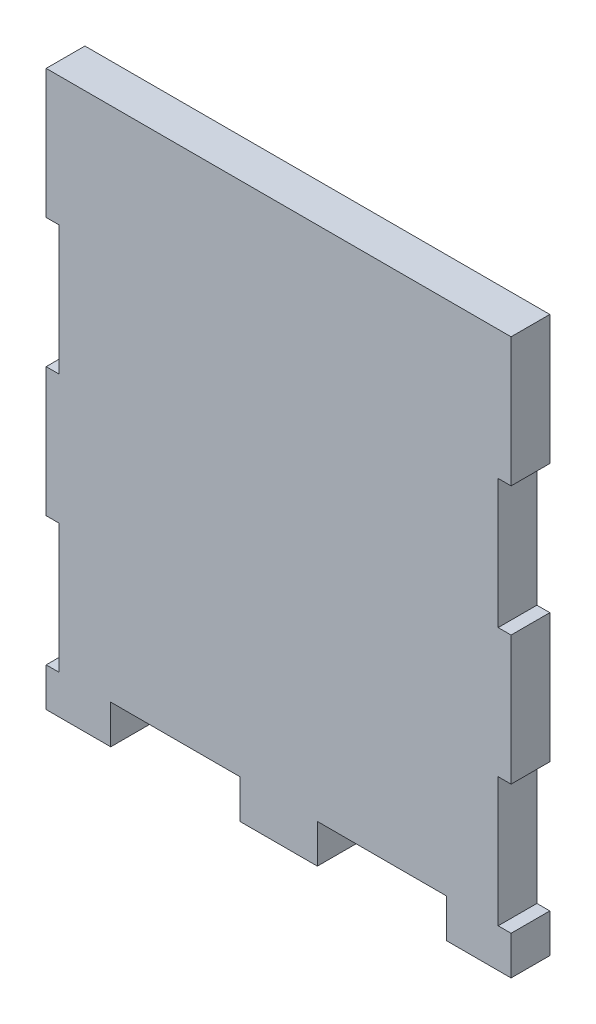
ISO-10303-21;
HEADER;
FILE_DESCRIPTION(('STEP AP214'),'2;1');
FILE_NAME('part.step','',(''),(''),'','','');
FILE_SCHEMA(('AUTOMOTIVE_DESIGN { 1 0 10303 214 1 1 1 1 }'));
ENDSEC;
DATA;
#1=APPLICATION_CONTEXT('core data for automotive mechanical design processes');
#2=APPLICATION_PROTOCOL_DEFINITION('international standard','automotive_design',2000,#1);
#3=PRODUCT_CONTEXT('',#1,'mechanical');
#4=PRODUCT('Part','Part','',(#3));
#5=PRODUCT_RELATED_PRODUCT_CATEGORY('part','',(#4));
#6=PRODUCT_DEFINITION_FORMATION('','',#4);
#7=PRODUCT_DEFINITION_CONTEXT('part definition',#1,'design');
#8=PRODUCT_DEFINITION('design','',#6,#7);
#9=PRODUCT_DEFINITION_SHAPE('','',#8);
#10=(LENGTH_UNIT() NAMED_UNIT(*) SI_UNIT(.MILLI.,.METRE.));
#11=(NAMED_UNIT(*) PLANE_ANGLE_UNIT() SI_UNIT($,.RADIAN.));
#12=(NAMED_UNIT(*) SI_UNIT($,.STERADIAN.) SOLID_ANGLE_UNIT());
#13=UNCERTAINTY_MEASURE_WITH_UNIT(LENGTH_MEASURE(1.E-05),#10,'distance_accuracy_value','');
#14=(GEOMETRIC_REPRESENTATION_CONTEXT(3) GLOBAL_UNCERTAINTY_ASSIGNED_CONTEXT((#13)) GLOBAL_UNIT_ASSIGNED_CONTEXT((#10,
#11,#12)) REPRESENTATION_CONTEXT('',''));
#15=CARTESIAN_POINT('',(0.,0.,0.));
#16=DIRECTION('',(0.,0.,1.));
#17=DIRECTION('',(1.,0.,0.));
#18=AXIS2_PLACEMENT_3D('',#15,#16,#17);
#19=CARTESIAN_POINT('',(0.,0.,3.));
#20=DIRECTION('',(0.,-1.,0.));
#21=DIRECTION('',(1.,0.,0.));
#22=AXIS2_PLACEMENT_3D('',#19,#20,#21);
#23=PLANE('',#22);
#24=DIRECTION('',(-1.,0.,0.));
#25=VECTOR('',#24,1.);
#26=CARTESIAN_POINT('',(0.,0.,0.));
#27=LINE('',#26,#25);
#28=CARTESIAN_POINT('',(15.,0.,0.));
#29=VERTEX_POINT('',#28);
#30=CARTESIAN_POINT('',(5.,0.,0.));
#31=VERTEX_POINT('',#30);
#32=EDGE_CURVE('E250',#29,#31,#27,.T.);
#33=ORIENTED_EDGE('',*,*,#32,.F.);
#34=DIRECTION('',(0.,0.,-1.));
#35=VECTOR('',#34,1.);
#36=CARTESIAN_POINT('',(15.,0.,3.));
#37=LINE('',#36,#35);
#38=CARTESIAN_POINT('',(15.,0.,3.));
#39=VERTEX_POINT('',#38);
#40=EDGE_CURVE('E11',#39,#29,#37,.T.);
#41=ORIENTED_EDGE('',*,*,#40,.F.);
#42=DIRECTION('',(-1.,0.,0.));
#43=VECTOR('',#42,1.);
#44=CARTESIAN_POINT('',(0.,0.,3.));
#45=LINE('',#44,#43);
#46=CARTESIAN_POINT('',(5.,0.,3.));
#47=VERTEX_POINT('',#46);
#48=EDGE_CURVE('E319',#39,#47,#45,.T.);
#49=ORIENTED_EDGE('',*,*,#48,.T.);
#50=DIRECTION('',(0.,0.,-1.));
#51=VECTOR('',#50,1.);
#52=CARTESIAN_POINT('',(5.,0.,3.));
#53=LINE('',#52,#51);
#54=EDGE_CURVE('E51',#47,#31,#53,.T.);
#55=ORIENTED_EDGE('',*,*,#54,.T.);
#56=EDGE_LOOP('',(#33,#41,#49,#55));
#57=FACE_BOUND('',#56,.T.);
#58=ADVANCED_FACE('F35',(#57),#23,.T.);
#59=CARTESIAN_POINT('',(15.,0.,3.));
#60=DIRECTION('',(1.,0.,0.));
#61=DIRECTION('',(0.,1.,0.));
#62=AXIS2_PLACEMENT_3D('',#59,#60,#61);
#63=PLANE('',#62);
#64=DIRECTION('',(0.,-1.,0.));
#65=VECTOR('',#64,1.);
#66=CARTESIAN_POINT('',(15.,0.,0.));
#67=LINE('',#66,#65);
#68=CARTESIAN_POINT('',(15.,-3.,0.));
#69=VERTEX_POINT('',#68);
#70=EDGE_CURVE('E252',#29,#69,#67,.T.);
#71=ORIENTED_EDGE('',*,*,#70,.T.);
#72=DIRECTION('',(0.,0.,-1.));
#73=VECTOR('',#72,1.);
#74=CARTESIAN_POINT('',(15.,-3.,3.));
#75=LINE('',#74,#73);
#76=CARTESIAN_POINT('',(15.,-3.,3.));
#77=VERTEX_POINT('',#76);
#78=EDGE_CURVE('E43',#77,#69,#75,.T.);
#79=ORIENTED_EDGE('',*,*,#78,.F.);
#80=DIRECTION('',(0.,-1.,0.));
#81=VECTOR('',#80,1.);
#82=CARTESIAN_POINT('',(15.,0.,3.));
#83=LINE('',#82,#81);
#84=EDGE_CURVE('E397',#39,#77,#83,.T.);
#85=ORIENTED_EDGE('',*,*,#84,.F.);
#86=ORIENTED_EDGE('',*,*,#40,.T.);
#87=EDGE_LOOP('',(#71,#79,#85,#86));
#88=FACE_BOUND('',#87,.T.);
#89=ADVANCED_FACE('F470',(#88),#63,.F.);
#90=CARTESIAN_POINT('',(0.,-3.,3.));
#91=DIRECTION('',(0.,1.,0.));
#92=DIRECTION('',(0.,0.,1.));
#93=AXIS2_PLACEMENT_3D('',#90,#91,#92);
#94=PLANE('',#93);
#95=DIRECTION('',(1.,0.,0.));
#96=VECTOR('',#95,1.);
#97=CARTESIAN_POINT('',(0.,-3.,0.));
#98=LINE('',#97,#96);
#99=CARTESIAN_POINT('',(21.,-3.,0.));
#100=VERTEX_POINT('',#99);
#101=EDGE_CURVE('E254',#69,#100,#98,.T.);
#102=ORIENTED_EDGE('',*,*,#101,.T.);
#103=DIRECTION('',(0.,0.,-1.));
#104=VECTOR('',#103,1.);
#105=CARTESIAN_POINT('',(21.,-3.,3.));
#106=LINE('',#105,#104);
#107=CARTESIAN_POINT('',(21.,-3.,3.));
#108=VERTEX_POINT('',#107);
#109=EDGE_CURVE('E370',#108,#100,#106,.T.);
#110=ORIENTED_EDGE('',*,*,#109,.F.);
#111=DIRECTION('',(1.,0.,0.));
#112=VECTOR('',#111,1.);
#113=CARTESIAN_POINT('',(0.,-3.,3.));
#114=LINE('',#113,#112);
#115=EDGE_CURVE('E378',#77,#108,#114,.T.);
#116=ORIENTED_EDGE('',*,*,#115,.F.);
#117=ORIENTED_EDGE('',*,*,#78,.T.);
#118=EDGE_LOOP('',(#102,#110,#116,#117));
#119=FACE_BOUND('',#118,.T.);
#120=ADVANCED_FACE('F376',(#119),#94,.F.);
#121=CARTESIAN_POINT('',(21.,0.,3.));
#122=DIRECTION('',(1.,0.,0.));
#123=DIRECTION('',(0.,0.,-1.));
#124=AXIS2_PLACEMENT_3D('',#121,#122,#123);
#125=PLANE('',#124);
#126=DIRECTION('',(0.,-1.,0.));
#127=VECTOR('',#126,1.);
#128=CARTESIAN_POINT('',(21.,0.,0.));
#129=LINE('',#128,#127);
#130=CARTESIAN_POINT('',(21.,0.,0.));
#131=VERTEX_POINT('',#130);
#132=EDGE_CURVE('E257',#131,#100,#129,.T.);
#133=ORIENTED_EDGE('',*,*,#132,.F.);
#134=DIRECTION('',(0.,0.,-1.));
#135=VECTOR('',#134,1.);
#136=CARTESIAN_POINT('',(21.,0.,3.));
#137=LINE('',#136,#135);
#138=CARTESIAN_POINT('',(21.,0.,3.));
#139=VERTEX_POINT('',#138);
#140=EDGE_CURVE('E368',#139,#131,#137,.T.);
#141=ORIENTED_EDGE('',*,*,#140,.F.);
#142=DIRECTION('',(0.,-1.,0.));
#143=VECTOR('',#142,1.);
#144=CARTESIAN_POINT('',(21.,0.,3.));
#145=LINE('',#144,#143);
#146=EDGE_CURVE('E390',#139,#108,#145,.T.);
#147=ORIENTED_EDGE('',*,*,#146,.T.);
#148=ORIENTED_EDGE('',*,*,#109,.T.);
#149=EDGE_LOOP('',(#133,#141,#147,#148));
#150=FACE_BOUND('',#149,.T.);
#151=ADVANCED_FACE('F387',(#150),#125,.T.);
#152=CARTESIAN_POINT('',(0.,0.,3.));
#153=DIRECTION('',(0.,-1.,0.));
#154=DIRECTION('',(1.,0.,0.));
#155=AXIS2_PLACEMENT_3D('',#152,#153,#154);
#156=PLANE('',#155);
#157=DIRECTION('',(-1.,0.,0.));
#158=VECTOR('',#157,1.);
#159=CARTESIAN_POINT('',(0.,0.,0.));
#160=LINE('',#159,#158);
#161=CARTESIAN_POINT('',(31.,0.,0.));
#162=VERTEX_POINT('',#161);
#163=EDGE_CURVE('E260',#162,#131,#160,.T.);
#164=ORIENTED_EDGE('',*,*,#163,.F.);
#165=DIRECTION('',(0.,0.,-1.));
#166=VECTOR('',#165,1.);
#167=CARTESIAN_POINT('',(31.,0.,3.));
#168=LINE('',#167,#166);
#169=CARTESIAN_POINT('',(31.,0.,3.));
#170=VERTEX_POINT('',#169);
#171=EDGE_CURVE('E366',#170,#162,#168,.T.);
#172=ORIENTED_EDGE('',*,*,#171,.F.);
#173=DIRECTION('',(-1.,0.,0.));
#174=VECTOR('',#173,1.);
#175=CARTESIAN_POINT('',(0.,0.,3.));
#176=LINE('',#175,#174);
#177=EDGE_CURVE('E393',#170,#139,#176,.T.);
#178=ORIENTED_EDGE('',*,*,#177,.T.);
#179=ORIENTED_EDGE('',*,*,#140,.T.);
#180=EDGE_LOOP('',(#164,#172,#178,#179));
#181=FACE_BOUND('',#180,.T.);
#182=ADVANCED_FACE('F705',(#181),#156,.T.);
#183=CARTESIAN_POINT('',(31.,0.,3.));
#184=DIRECTION('',(1.,0.,0.));
#185=DIRECTION('',(0.,0.,-1.));
#186=AXIS2_PLACEMENT_3D('',#183,#184,#185);
#187=PLANE('',#186);
#188=DIRECTION('',(0.,-1.,0.));
#189=VECTOR('',#188,1.);
#190=CARTESIAN_POINT('',(31.,0.,0.));
#191=LINE('',#190,#189);
#192=CARTESIAN_POINT('',(31.,-3.,0.));
#193=VERTEX_POINT('',#192);
#194=EDGE_CURVE('E263',#162,#193,#191,.T.);
#195=ORIENTED_EDGE('',*,*,#194,.T.);
#196=DIRECTION('',(0.,0.,-1.));
#197=VECTOR('',#196,1.);
#198=CARTESIAN_POINT('',(31.,-3.,3.));
#199=LINE('',#198,#197);
#200=CARTESIAN_POINT('',(31.,-3.,3.));
#201=VERTEX_POINT('',#200);
#202=EDGE_CURVE('E363',#201,#193,#199,.T.);
#203=ORIENTED_EDGE('',*,*,#202,.F.);
#204=DIRECTION('',(0.,-1.,0.));
#205=VECTOR('',#204,1.);
#206=CARTESIAN_POINT('',(31.,0.,3.));
#207=LINE('',#206,#205);
#208=EDGE_CURVE('E395',#170,#201,#207,.T.);
#209=ORIENTED_EDGE('',*,*,#208,.F.);
#210=ORIENTED_EDGE('',*,*,#171,.T.);
#211=EDGE_LOOP('',(#195,#203,#209,#210));
#212=FACE_BOUND('',#211,.T.);
#213=ADVANCED_FACE('F695',(#212),#187,.F.);
#214=CARTESIAN_POINT('',(0.,-3.,3.));
#215=DIRECTION('',(0.,1.,0.));
#216=DIRECTION('',(0.,0.,1.));
#217=AXIS2_PLACEMENT_3D('',#214,#215,#216);
#218=PLANE('',#217);
#219=DIRECTION('',(1.,0.,0.));
#220=VECTOR('',#219,1.);
#221=CARTESIAN_POINT('',(0.,-3.,0.));
#222=LINE('',#221,#220);
#223=CARTESIAN_POINT('',(36.,-3.,0.));
#224=VERTEX_POINT('',#223);
#225=EDGE_CURVE('E265',#193,#224,#222,.T.);
#226=ORIENTED_EDGE('',*,*,#225,.T.);
#227=DIRECTION('',(0.,0.,-1.));
#228=VECTOR('',#227,1.);
#229=CARTESIAN_POINT('',(36.,-3.,3.));
#230=LINE('',#229,#228);
#231=CARTESIAN_POINT('',(36.,-3.,3.));
#232=VERTEX_POINT('',#231);
#233=EDGE_CURVE('E360',#232,#224,#230,.T.);
#234=ORIENTED_EDGE('',*,*,#233,.F.);
#235=DIRECTION('',(1.,0.,0.));
#236=VECTOR('',#235,1.);
#237=CARTESIAN_POINT('',(0.,-3.,3.));
#238=LINE('',#237,#236);
#239=EDGE_CURVE('E402',#201,#232,#238,.T.);
#240=ORIENTED_EDGE('',*,*,#239,.F.);
#241=ORIENTED_EDGE('',*,*,#202,.T.);
#242=EDGE_LOOP('',(#226,#234,#240,#241));
#243=FACE_BOUND('',#242,.T.);
#244=ADVANCED_FACE('F685',(#243),#218,.F.);
#245=CARTESIAN_POINT('',(36.,0.,3.));
#246=DIRECTION('',(-1.,0.,0.));
#247=DIRECTION('',(0.,0.,1.));
#248=AXIS2_PLACEMENT_3D('',#245,#246,#247);
#249=PLANE('',#248);
#250=DIRECTION('',(0.,1.,0.));
#251=VECTOR('',#250,1.);
#252=CARTESIAN_POINT('',(36.,0.,0.));
#253=LINE('',#252,#251);
#254=CARTESIAN_POINT('',(36.,0.,0.));
#255=VERTEX_POINT('',#254);
#256=EDGE_CURVE('E267',#224,#255,#253,.T.);
#257=ORIENTED_EDGE('',*,*,#256,.T.);
#258=DIRECTION('',(0.,0.,-1.));
#259=VECTOR('',#258,1.);
#260=CARTESIAN_POINT('',(36.,0.,3.));
#261=LINE('',#260,#259);
#262=CARTESIAN_POINT('',(36.,0.,3.));
#263=VERTEX_POINT('',#262);
#264=EDGE_CURVE('E357',#263,#255,#261,.T.);
#265=ORIENTED_EDGE('',*,*,#264,.F.);
#266=DIRECTION('',(0.,1.,0.));
#267=VECTOR('',#266,1.);
#268=CARTESIAN_POINT('',(36.,0.,3.));
#269=LINE('',#268,#267);
#270=EDGE_CURVE('E404',#232,#263,#269,.T.);
#271=ORIENTED_EDGE('',*,*,#270,.F.);
#272=ORIENTED_EDGE('',*,*,#233,.T.);
#273=EDGE_LOOP('',(#257,#265,#271,#272));
#274=FACE_BOUND('',#273,.T.);
#275=ADVANCED_FACE('F673',(#274),#249,.F.);
#276=CARTESIAN_POINT('',(0.,0.,3.));
#277=DIRECTION('',(0.,-1.,0.));
#278=DIRECTION('',(1.,0.,0.));
#279=AXIS2_PLACEMENT_3D('',#276,#277,#278);
#280=PLANE('',#279);
#281=DIRECTION('',(-1.,0.,0.));
#282=VECTOR('',#281,1.);
#283=CARTESIAN_POINT('',(0.,0.,0.));
#284=LINE('',#283,#282);
#285=CARTESIAN_POINT('',(35.,0.,0.));
#286=VERTEX_POINT('',#285);
#287=EDGE_CURVE('E269',#255,#286,#284,.T.);
#288=ORIENTED_EDGE('',*,*,#287,.T.);
#289=DIRECTION('',(0.,0.,-1.));
#290=VECTOR('',#289,1.);
#291=CARTESIAN_POINT('',(35.,0.,3.));
#292=LINE('',#291,#290);
#293=CARTESIAN_POINT('',(35.,0.,3.));
#294=VERTEX_POINT('',#293);
#295=EDGE_CURVE('E354',#294,#286,#292,.T.);
#296=ORIENTED_EDGE('',*,*,#295,.F.);
#297=DIRECTION('',(-1.,0.,0.));
#298=VECTOR('',#297,1.);
#299=CARTESIAN_POINT('',(0.,0.,3.));
#300=LINE('',#299,#298);
#301=EDGE_CURVE('E406',#263,#294,#300,.T.);
#302=ORIENTED_EDGE('',*,*,#301,.F.);
#303=ORIENTED_EDGE('',*,*,#264,.T.);
#304=EDGE_LOOP('',(#288,#296,#302,#303));
#305=FACE_BOUND('',#304,.T.);
#306=ADVANCED_FACE('F663',(#305),#280,.F.);
#307=CARTESIAN_POINT('',(35.,0.,3.));
#308=DIRECTION('',(-1.,0.,0.));
#309=DIRECTION('',(0.,0.,1.));
#310=AXIS2_PLACEMENT_3D('',#307,#308,#309);
#311=PLANE('',#310);
#312=DIRECTION('',(0.,1.,0.));
#313=VECTOR('',#312,1.);
#314=CARTESIAN_POINT('',(35.,0.,0.));
#315=LINE('',#314,#313);
#316=CARTESIAN_POINT('',(35.,10.,0.));
#317=VERTEX_POINT('',#316);
#318=EDGE_CURVE('E271',#286,#317,#315,.T.);
#319=ORIENTED_EDGE('',*,*,#318,.T.);
#320=DIRECTION('',(0.,0.,-1.));
#321=VECTOR('',#320,1.);
#322=CARTESIAN_POINT('',(35.,10.,3.));
#323=LINE('',#322,#321);
#324=CARTESIAN_POINT('',(35.,10.,3.));
#325=VERTEX_POINT('',#324);
#326=EDGE_CURVE('E352',#325,#317,#323,.T.);
#327=ORIENTED_EDGE('',*,*,#326,.F.);
#328=DIRECTION('',(0.,1.,0.));
#329=VECTOR('',#328,1.);
#330=CARTESIAN_POINT('',(35.,0.,3.));
#331=LINE('',#330,#329);
#332=EDGE_CURVE('E408',#294,#325,#331,.T.);
#333=ORIENTED_EDGE('',*,*,#332,.F.);
#334=ORIENTED_EDGE('',*,*,#295,.T.);
#335=EDGE_LOOP('',(#319,#327,#333,#334));
#336=FACE_BOUND('',#335,.T.);
#337=ADVANCED_FACE('F624',(#336),#311,.F.);
#338=CARTESIAN_POINT('',(0.,9.99999999999988,3.));
#339=DIRECTION('',(0.,-1.,0.));
#340=DIRECTION('',(1.,0.,0.));
#341=AXIS2_PLACEMENT_3D('',#338,#339,#340);
#342=PLANE('',#341);
#343=DIRECTION('',(-1.,0.,0.));
#344=VECTOR('',#343,1.);
#345=CARTESIAN_POINT('',(0.,9.99999999999988,0.));
#346=LINE('',#345,#344);
#347=CARTESIAN_POINT('',(36.,10.,0.));
#348=VERTEX_POINT('',#347);
#349=EDGE_CURVE('E274',#348,#317,#346,.T.);
#350=ORIENTED_EDGE('',*,*,#349,.F.);
#351=DIRECTION('',(0.,0.,-1.));
#352=VECTOR('',#351,1.);
#353=CARTESIAN_POINT('',(36.,10.,3.));
#354=LINE('',#353,#352);
#355=CARTESIAN_POINT('',(36.,10.,3.));
#356=VERTEX_POINT('',#355);
#357=EDGE_CURVE('E350',#356,#348,#354,.T.);
#358=ORIENTED_EDGE('',*,*,#357,.F.);
#359=DIRECTION('',(-1.,0.,0.));
#360=VECTOR('',#359,1.);
#361=CARTESIAN_POINT('',(0.,9.99999999999988,3.));
#362=LINE('',#361,#360);
#363=EDGE_CURVE('E410',#356,#325,#362,.T.);
#364=ORIENTED_EDGE('',*,*,#363,.T.);
#365=ORIENTED_EDGE('',*,*,#326,.T.);
#366=EDGE_LOOP('',(#350,#358,#364,#365));
#367=FACE_BOUND('',#366,.T.);
#368=ADVANCED_FACE('F644',(#367),#342,.T.);
#369=CARTESIAN_POINT('',(36.,0.,3.));
#370=DIRECTION('',(1.,0.,0.));
#371=DIRECTION('',(0.,1.,0.));
#372=AXIS2_PLACEMENT_3D('',#369,#370,#371);
#373=PLANE('',#372);
#374=DIRECTION('',(0.,-1.,0.));
#375=VECTOR('',#374,1.);
#376=CARTESIAN_POINT('',(36.,0.,0.));
#377=LINE('',#376,#375);
#378=CARTESIAN_POINT('',(36.,20.,0.));
#379=VERTEX_POINT('',#378);
#380=EDGE_CURVE('E278',#379,#348,#377,.T.);
#381=ORIENTED_EDGE('',*,*,#380,.F.);
#382=DIRECTION('',(0.,0.,-1.));
#383=VECTOR('',#382,1.);
#384=CARTESIAN_POINT('',(36.,20.,3.));
#385=LINE('',#384,#383);
#386=CARTESIAN_POINT('',(36.,20.,3.));
#387=VERTEX_POINT('',#386);
#388=EDGE_CURVE('E348',#387,#379,#385,.T.);
#389=ORIENTED_EDGE('',*,*,#388,.F.);
#390=DIRECTION('',(0.,-1.,0.));
#391=VECTOR('',#390,1.);
#392=CARTESIAN_POINT('',(36.,0.,3.));
#393=LINE('',#392,#391);
#394=EDGE_CURVE('E414',#387,#356,#393,.T.);
#395=ORIENTED_EDGE('',*,*,#394,.T.);
#396=ORIENTED_EDGE('',*,*,#357,.T.);
#397=EDGE_LOOP('',(#381,#389,#395,#396));
#398=FACE_BOUND('',#397,.T.);
#399=ADVANCED_FACE('F633',(#398),#373,.T.);
#400=CARTESIAN_POINT('',(0.,20.,3.));
#401=DIRECTION('',(0.,-1.,0.));
#402=DIRECTION('',(0.,0.,-1.));
#403=AXIS2_PLACEMENT_3D('',#400,#401,#402);
#404=PLANE('',#403);
#405=DIRECTION('',(-1.,0.,0.));
#406=VECTOR('',#405,1.);
#407=CARTESIAN_POINT('',(0.,20.,0.));
#408=LINE('',#407,#406);
#409=CARTESIAN_POINT('',(35.,20.,0.));
#410=VERTEX_POINT('',#409);
#411=EDGE_CURVE('E281',#379,#410,#408,.T.);
#412=ORIENTED_EDGE('',*,*,#411,.T.);
#413=DIRECTION('',(0.,0.,-1.));
#414=VECTOR('',#413,1.);
#415=CARTESIAN_POINT('',(35.,20.,3.));
#416=LINE('',#415,#414);
#417=CARTESIAN_POINT('',(35.,20.,3.));
#418=VERTEX_POINT('',#417);
#419=EDGE_CURVE('E345',#418,#410,#416,.T.);
#420=ORIENTED_EDGE('',*,*,#419,.F.);
#421=DIRECTION('',(-1.,0.,0.));
#422=VECTOR('',#421,1.);
#423=CARTESIAN_POINT('',(0.,20.,3.));
#424=LINE('',#423,#422);
#425=EDGE_CURVE('E417',#387,#418,#424,.T.);
#426=ORIENTED_EDGE('',*,*,#425,.F.);
#427=ORIENTED_EDGE('',*,*,#388,.T.);
#428=EDGE_LOOP('',(#412,#420,#426,#427));
#429=FACE_BOUND('',#428,.T.);
#430=ADVANCED_FACE('F621',(#429),#404,.F.);
#431=CARTESIAN_POINT('',(35.,30.,0.));
#432=VERTEX_POINT('',#431);
#433=EDGE_CURVE('E275',#410,#432,#315,.T.);
#434=ORIENTED_EDGE('',*,*,#433,.T.);
#435=DIRECTION('',(0.,0.,-1.));
#436=VECTOR('',#435,1.);
#437=CARTESIAN_POINT('',(35.,30.,3.));
#438=LINE('',#437,#436);
#439=CARTESIAN_POINT('',(35.,30.,3.));
#440=VERTEX_POINT('',#439);
#441=EDGE_CURVE('E343',#440,#432,#438,.T.);
#442=ORIENTED_EDGE('',*,*,#441,.F.);
#443=EDGE_CURVE('E411',#418,#440,#331,.T.);
#444=ORIENTED_EDGE('',*,*,#443,.F.);
#445=ORIENTED_EDGE('',*,*,#419,.T.);
#446=EDGE_LOOP('',(#434,#442,#444,#445));
#447=FACE_BOUND('',#446,.T.);
#448=ADVANCED_FACE('F611',(#447),#311,.F.);
#449=CARTESIAN_POINT('',(0.,30.,3.));
#450=DIRECTION('',(0.,-1.,0.));
#451=DIRECTION('',(0.,0.,-1.));
#452=AXIS2_PLACEMENT_3D('',#449,#450,#451);
#453=PLANE('',#452);
#454=DIRECTION('',(-1.,0.,0.));
#455=VECTOR('',#454,1.);
#456=CARTESIAN_POINT('',(0.,30.,0.));
#457=LINE('',#456,#455);
#458=CARTESIAN_POINT('',(36.,30.,0.));
#459=VERTEX_POINT('',#458);
#460=EDGE_CURVE('E283',#459,#432,#457,.T.);
#461=ORIENTED_EDGE('',*,*,#460,.F.);
#462=DIRECTION('',(0.,0.,-1.));
#463=VECTOR('',#462,1.);
#464=CARTESIAN_POINT('',(36.,30.,3.));
#465=LINE('',#464,#463);
#466=CARTESIAN_POINT('',(36.,30.,3.));
#467=VERTEX_POINT('',#466);
#468=EDGE_CURVE('E341',#467,#459,#465,.T.);
#469=ORIENTED_EDGE('',*,*,#468,.F.);
#470=DIRECTION('',(-1.,0.,0.));
#471=VECTOR('',#470,1.);
#472=CARTESIAN_POINT('',(0.,30.,3.));
#473=LINE('',#472,#471);
#474=EDGE_CURVE('E419',#467,#440,#473,.T.);
#475=ORIENTED_EDGE('',*,*,#474,.T.);
#476=ORIENTED_EDGE('',*,*,#441,.T.);
#477=EDGE_LOOP('',(#461,#469,#475,#476));
#478=FACE_BOUND('',#477,.T.);
#479=ADVANCED_FACE('F601',(#478),#453,.T.);
#480=CARTESIAN_POINT('',(36.,0.,3.));
#481=DIRECTION('',(1.,0.,0.));
#482=DIRECTION('',(0.,1.,0.));
#483=AXIS2_PLACEMENT_3D('',#480,#481,#482);
#484=PLANE('',#483);
#485=DIRECTION('',(0.,-1.,0.));
#486=VECTOR('',#485,1.);
#487=CARTESIAN_POINT('',(36.,0.,0.));
#488=LINE('',#487,#486);
#489=CARTESIAN_POINT('',(36.,40.,0.));
#490=VERTEX_POINT('',#489);
#491=EDGE_CURVE('E286',#490,#459,#488,.T.);
#492=ORIENTED_EDGE('',*,*,#491,.F.);
#493=DIRECTION('',(0.,0.,-1.));
#494=VECTOR('',#493,1.);
#495=CARTESIAN_POINT('',(36.,40.,3.));
#496=LINE('',#495,#494);
#497=CARTESIAN_POINT('',(36.,40.,3.));
#498=VERTEX_POINT('',#497);
#499=EDGE_CURVE('E339',#498,#490,#496,.T.);
#500=ORIENTED_EDGE('',*,*,#499,.F.);
#501=DIRECTION('',(0.,-1.,0.));
#502=VECTOR('',#501,1.);
#503=CARTESIAN_POINT('',(36.,0.,3.));
#504=LINE('',#503,#502);
#505=EDGE_CURVE('E422',#498,#467,#504,.T.);
#506=ORIENTED_EDGE('',*,*,#505,.T.);
#507=ORIENTED_EDGE('',*,*,#468,.T.);
#508=EDGE_LOOP('',(#492,#500,#506,#507));
#509=FACE_BOUND('',#508,.T.);
#510=ADVANCED_FACE('F591',(#509),#484,.T.);
#511=CARTESIAN_POINT('',(0.,40.,3.));
#512=DIRECTION('',(0.,1.,0.));
#513=DIRECTION('',(0.,0.,1.));
#514=AXIS2_PLACEMENT_3D('',#511,#512,#513);
#515=PLANE('',#514);
#516=DIRECTION('',(1.,0.,0.));
#517=VECTOR('',#516,1.);
#518=CARTESIAN_POINT('',(0.,40.,0.));
#519=LINE('',#518,#517);
#520=CARTESIAN_POINT('',(0.,40.,0.));
#521=VERTEX_POINT('',#520);
#522=EDGE_CURVE('E289',#521,#490,#519,.T.);
#523=ORIENTED_EDGE('',*,*,#522,.F.);
#524=DIRECTION('',(0.,0.,-1.));
#525=VECTOR('',#524,1.);
#526=CARTESIAN_POINT('',(0.,40.,3.));
#527=LINE('',#526,#525);
#528=CARTESIAN_POINT('',(0.,40.,3.));
#529=VERTEX_POINT('',#528);
#530=EDGE_CURVE('E337',#529,#521,#527,.T.);
#531=ORIENTED_EDGE('',*,*,#530,.F.);
#532=DIRECTION('',(1.,0.,0.));
#533=VECTOR('',#532,1.);
#534=CARTESIAN_POINT('',(0.,40.,3.));
#535=LINE('',#534,#533);
#536=EDGE_CURVE('E425',#529,#498,#535,.T.);
#537=ORIENTED_EDGE('',*,*,#536,.T.);
#538=ORIENTED_EDGE('',*,*,#499,.T.);
#539=EDGE_LOOP('',(#523,#531,#537,#538));
#540=FACE_BOUND('',#539,.T.);
#541=ADVANCED_FACE('F581',(#540),#515,.T.);
#542=CARTESIAN_POINT('',(0.,0.,3.));
#543=DIRECTION('',(-1.,0.,0.));
#544=DIRECTION('',(0.,0.,1.));
#545=AXIS2_PLACEMENT_3D('',#542,#543,#544);
#546=PLANE('',#545);
#547=DIRECTION('',(0.,1.,0.));
#548=VECTOR('',#547,1.);
#549=CARTESIAN_POINT('',(0.,0.,0.));
#550=LINE('',#549,#548);
#551=CARTESIAN_POINT('',(0.,30.,0.));
#552=VERTEX_POINT('',#551);
#553=EDGE_CURVE('E292',#552,#521,#550,.T.);
#554=ORIENTED_EDGE('',*,*,#553,.F.);
#555=DIRECTION('',(0.,0.,-1.));
#556=VECTOR('',#555,1.);
#557=CARTESIAN_POINT('',(0.,30.,3.));
#558=LINE('',#557,#556);
#559=CARTESIAN_POINT('',(0.,30.,3.));
#560=VERTEX_POINT('',#559);
#561=EDGE_CURVE('E335',#560,#552,#558,.T.);
#562=ORIENTED_EDGE('',*,*,#561,.F.);
#563=DIRECTION('',(0.,1.,0.));
#564=VECTOR('',#563,1.);
#565=CARTESIAN_POINT('',(0.,0.,3.));
#566=LINE('',#565,#564);
#567=EDGE_CURVE('E428',#560,#529,#566,.T.);
#568=ORIENTED_EDGE('',*,*,#567,.T.);
#569=ORIENTED_EDGE('',*,*,#530,.T.);
#570=EDGE_LOOP('',(#554,#562,#568,#569));
#571=FACE_BOUND('',#570,.T.);
#572=ADVANCED_FACE('F570',(#571),#546,.T.);
#573=CARTESIAN_POINT('',(0.,30.,3.));
#574=DIRECTION('',(0.,1.,0.));
#575=DIRECTION('',(0.,0.,1.));
#576=AXIS2_PLACEMENT_3D('',#573,#574,#575);
#577=PLANE('',#576);
#578=DIRECTION('',(1.,0.,0.));
#579=VECTOR('',#578,1.);
#580=CARTESIAN_POINT('',(0.,30.,0.));
#581=LINE('',#580,#579);
#582=CARTESIAN_POINT('',(1.,30.,0.));
#583=VERTEX_POINT('',#582);
#584=EDGE_CURVE('E295',#552,#583,#581,.T.);
#585=ORIENTED_EDGE('',*,*,#584,.T.);
#586=DIRECTION('',(0.,0.,-1.));
#587=VECTOR('',#586,1.);
#588=CARTESIAN_POINT('',(1.,30.,3.));
#589=LINE('',#588,#587);
#590=CARTESIAN_POINT('',(1.,30.,3.));
#591=VERTEX_POINT('',#590);
#592=EDGE_CURVE('E333',#591,#583,#589,.T.);
#593=ORIENTED_EDGE('',*,*,#592,.F.);
#594=DIRECTION('',(1.,0.,0.));
#595=VECTOR('',#594,1.);
#596=CARTESIAN_POINT('',(0.,30.,3.));
#597=LINE('',#596,#595);
#598=EDGE_CURVE('E431',#560,#591,#597,.T.);
#599=ORIENTED_EDGE('',*,*,#598,.F.);
#600=ORIENTED_EDGE('',*,*,#561,.T.);
#601=EDGE_LOOP('',(#585,#593,#599,#600));
#602=FACE_BOUND('',#601,.T.);
#603=ADVANCED_FACE('F560',(#602),#577,.F.);
#604=CARTESIAN_POINT('',(1.,0.,3.));
#605=DIRECTION('',(-1.,0.,0.));
#606=DIRECTION('',(0.,0.,1.));
#607=AXIS2_PLACEMENT_3D('',#604,#605,#606);
#608=PLANE('',#607);
#609=DIRECTION('',(0.,1.,0.));
#610=VECTOR('',#609,1.);
#611=CARTESIAN_POINT('',(1.,0.,0.));
#612=LINE('',#611,#610);
#613=CARTESIAN_POINT('',(1.,20.,0.));
#614=VERTEX_POINT('',#613);
#615=EDGE_CURVE('E298',#614,#583,#612,.T.);
#616=ORIENTED_EDGE('',*,*,#615,.F.);
#617=DIRECTION('',(0.,0.,-1.));
#618=VECTOR('',#617,1.);
#619=CARTESIAN_POINT('',(1.,20.,3.));
#620=LINE('',#619,#618);
#621=CARTESIAN_POINT('',(1.,20.,3.));
#622=VERTEX_POINT('',#621);
#623=EDGE_CURVE('E331',#622,#614,#620,.T.);
#624=ORIENTED_EDGE('',*,*,#623,.F.);
#625=DIRECTION('',(0.,1.,0.));
#626=VECTOR('',#625,1.);
#627=CARTESIAN_POINT('',(1.,0.,3.));
#628=LINE('',#627,#626);
#629=EDGE_CURVE('E433',#622,#591,#628,.T.);
#630=ORIENTED_EDGE('',*,*,#629,.T.);
#631=ORIENTED_EDGE('',*,*,#592,.T.);
#632=EDGE_LOOP('',(#616,#624,#630,#631));
#633=FACE_BOUND('',#632,.T.);
#634=ADVANCED_FACE('F468',(#633),#608,.T.);
#635=CARTESIAN_POINT('',(0.,20.,3.));
#636=DIRECTION('',(0.,1.,0.));
#637=DIRECTION('',(0.,0.,1.));
#638=AXIS2_PLACEMENT_3D('',#635,#636,#637);
#639=PLANE('',#638);
#640=DIRECTION('',(1.,0.,0.));
#641=VECTOR('',#640,1.);
#642=CARTESIAN_POINT('',(0.,20.,0.));
#643=LINE('',#642,#641);
#644=CARTESIAN_POINT('',(0.,20.,0.));
#645=VERTEX_POINT('',#644);
#646=EDGE_CURVE('E301',#645,#614,#643,.T.);
#647=ORIENTED_EDGE('',*,*,#646,.F.);
#648=DIRECTION('',(0.,0.,-1.));
#649=VECTOR('',#648,1.);
#650=CARTESIAN_POINT('',(0.,20.,3.));
#651=LINE('',#650,#649);
#652=CARTESIAN_POINT('',(0.,20.,3.));
#653=VERTEX_POINT('',#652);
#654=EDGE_CURVE('E329',#653,#645,#651,.T.);
#655=ORIENTED_EDGE('',*,*,#654,.F.);
#656=DIRECTION('',(1.,0.,0.));
#657=VECTOR('',#656,1.);
#658=CARTESIAN_POINT('',(0.,20.,3.));
#659=LINE('',#658,#657);
#660=EDGE_CURVE('E436',#653,#622,#659,.T.);
#661=ORIENTED_EDGE('',*,*,#660,.T.);
#662=ORIENTED_EDGE('',*,*,#623,.T.);
#663=EDGE_LOOP('',(#647,#655,#661,#662));
#664=FACE_BOUND('',#663,.T.);
#665=ADVANCED_FACE('F541',(#664),#639,.T.);
#666=CARTESIAN_POINT('',(0.,0.,3.));
#667=DIRECTION('',(-1.,0.,0.));
#668=DIRECTION('',(0.,0.,1.));
#669=AXIS2_PLACEMENT_3D('',#666,#667,#668);
#670=PLANE('',#669);
#671=DIRECTION('',(0.,1.,0.));
#672=VECTOR('',#671,1.);
#673=CARTESIAN_POINT('',(0.,0.,0.));
#674=LINE('',#673,#672);
#675=CARTESIAN_POINT('',(0.,10.,0.));
#676=VERTEX_POINT('',#675);
#677=EDGE_CURVE('E305',#676,#645,#674,.T.);
#678=ORIENTED_EDGE('',*,*,#677,.F.);
#679=DIRECTION('',(0.,0.,-1.));
#680=VECTOR('',#679,1.);
#681=CARTESIAN_POINT('',(0.,10.,3.));
#682=LINE('',#681,#680);
#683=CARTESIAN_POINT('',(0.,10.,3.));
#684=VERTEX_POINT('',#683);
#685=EDGE_CURVE('E327',#684,#676,#682,.T.);
#686=ORIENTED_EDGE('',*,*,#685,.F.);
#687=DIRECTION('',(0.,1.,0.));
#688=VECTOR('',#687,1.);
#689=CARTESIAN_POINT('',(0.,0.,3.));
#690=LINE('',#689,#688);
#691=EDGE_CURVE('E440',#684,#653,#690,.T.);
#692=ORIENTED_EDGE('',*,*,#691,.T.);
#693=ORIENTED_EDGE('',*,*,#654,.T.);
#694=EDGE_LOOP('',(#678,#686,#692,#693));
#695=FACE_BOUND('',#694,.T.);
#696=ADVANCED_FACE('F531',(#695),#670,.T.);
#697=CARTESIAN_POINT('',(0.,10.,3.));
#698=DIRECTION('',(0.,1.,0.));
#699=DIRECTION('',(0.,0.,1.));
#700=AXIS2_PLACEMENT_3D('',#697,#698,#699);
#701=PLANE('',#700);
#702=DIRECTION('',(1.,0.,0.));
#703=VECTOR('',#702,1.);
#704=CARTESIAN_POINT('',(0.,10.,0.));
#705=LINE('',#704,#703);
#706=CARTESIAN_POINT('',(1.,10.,0.));
#707=VERTEX_POINT('',#706);
#708=EDGE_CURVE('E308',#676,#707,#705,.T.);
#709=ORIENTED_EDGE('',*,*,#708,.T.);
#710=DIRECTION('',(0.,0.,-1.));
#711=VECTOR('',#710,1.);
#712=CARTESIAN_POINT('',(1.,10.,3.));
#713=LINE('',#712,#711);
#714=CARTESIAN_POINT('',(1.,10.,3.));
#715=VERTEX_POINT('',#714);
#716=EDGE_CURVE('E325',#715,#707,#713,.T.);
#717=ORIENTED_EDGE('',*,*,#716,.F.);
#718=DIRECTION('',(1.,0.,0.));
#719=VECTOR('',#718,1.);
#720=CARTESIAN_POINT('',(0.,10.,3.));
#721=LINE('',#720,#719);
#722=EDGE_CURVE('E443',#684,#715,#721,.T.);
#723=ORIENTED_EDGE('',*,*,#722,.F.);
#724=ORIENTED_EDGE('',*,*,#685,.T.);
#725=EDGE_LOOP('',(#709,#717,#723,#724));
#726=FACE_BOUND('',#725,.T.);
#727=ADVANCED_FACE('F453',(#726),#701,.F.);
#728=CARTESIAN_POINT('',(1.,0.,0.));
#729=VERTEX_POINT('',#728);
#730=EDGE_CURVE('E302',#729,#707,#612,.T.);
#731=ORIENTED_EDGE('',*,*,#730,.F.);
#732=DIRECTION('',(0.,0.,-1.));
#733=VECTOR('',#732,1.);
#734=CARTESIAN_POINT('',(1.,0.,3.));
#735=LINE('',#734,#733);
#736=CARTESIAN_POINT('',(1.,0.,3.));
#737=VERTEX_POINT('',#736);
#738=EDGE_CURVE('E323',#737,#729,#735,.T.);
#739=ORIENTED_EDGE('',*,*,#738,.F.);
#740=EDGE_CURVE('E437',#737,#715,#628,.T.);
#741=ORIENTED_EDGE('',*,*,#740,.T.);
#742=ORIENTED_EDGE('',*,*,#716,.T.);
#743=EDGE_LOOP('',(#731,#739,#741,#742));
#744=FACE_BOUND('',#743,.T.);
#745=ADVANCED_FACE('F447',(#744),#608,.T.);
#746=CARTESIAN_POINT('',(0.,0.,3.));
#747=DIRECTION('',(0.,-1.,0.));
#748=DIRECTION('',(1.,0.,0.));
#749=AXIS2_PLACEMENT_3D('',#746,#747,#748);
#750=PLANE('',#749);
#751=DIRECTION('',(-1.,0.,0.));
#752=VECTOR('',#751,1.);
#753=CARTESIAN_POINT('',(0.,0.,0.));
#754=LINE('',#753,#752);
#755=CARTESIAN_POINT('',(0.,0.,0.));
#756=VERTEX_POINT('',#755);
#757=EDGE_CURVE('E311',#729,#756,#754,.T.);
#758=ORIENTED_EDGE('',*,*,#757,.T.);
#759=DIRECTION('',(0.,0.,-1.));
#760=VECTOR('',#759,1.);
#761=CARTESIAN_POINT('',(0.,0.,3.));
#762=LINE('',#761,#760);
#763=CARTESIAN_POINT('',(0.,0.,3.));
#764=VERTEX_POINT('',#763);
#765=EDGE_CURVE('E242',#764,#756,#762,.T.);
#766=ORIENTED_EDGE('',*,*,#765,.F.);
#767=DIRECTION('',(-1.,0.,0.));
#768=VECTOR('',#767,1.);
#769=CARTESIAN_POINT('',(0.,0.,3.));
#770=LINE('',#769,#768);
#771=EDGE_CURVE('E230',#737,#764,#770,.T.);
#772=ORIENTED_EDGE('',*,*,#771,.F.);
#773=ORIENTED_EDGE('',*,*,#738,.T.);
#774=EDGE_LOOP('',(#758,#766,#772,#773));
#775=FACE_BOUND('',#774,.T.);
#776=ADVANCED_FACE('F459',(#775),#750,.F.);
#777=CARTESIAN_POINT('',(0.,0.,3.));
#778=DIRECTION('',(1.,0.,0.));
#779=DIRECTION('',(0.,0.,-1.));
#780=AXIS2_PLACEMENT_3D('',#777,#778,#779);
#781=PLANE('',#780);
#782=DIRECTION('',(0.,-1.,0.));
#783=VECTOR('',#782,1.);
#784=CARTESIAN_POINT('',(0.,0.,0.));
#785=LINE('',#784,#783);
#786=CARTESIAN_POINT('',(0.,-3.,0.));
#787=VERTEX_POINT('',#786);
#788=EDGE_CURVE('E239',#756,#787,#785,.T.);
#789=ORIENTED_EDGE('',*,*,#788,.T.);
#790=DIRECTION('',(0.,0.,-1.));
#791=VECTOR('',#790,1.);
#792=CARTESIAN_POINT('',(0.,-3.,3.));
#793=LINE('',#792,#791);
#794=CARTESIAN_POINT('',(0.,-3.,3.));
#795=VERTEX_POINT('',#794);
#796=EDGE_CURVE('E236',#795,#787,#793,.T.);
#797=ORIENTED_EDGE('',*,*,#796,.F.);
#798=DIRECTION('',(0.,-1.,0.));
#799=VECTOR('',#798,1.);
#800=CARTESIAN_POINT('',(0.,0.,3.));
#801=LINE('',#800,#799);
#802=EDGE_CURVE('E221',#764,#795,#801,.T.);
#803=ORIENTED_EDGE('',*,*,#802,.F.);
#804=ORIENTED_EDGE('',*,*,#765,.T.);
#805=EDGE_LOOP('',(#789,#797,#803,#804));
#806=FACE_BOUND('',#805,.T.);
#807=ADVANCED_FACE('F237',(#806),#781,.F.);
#808=CARTESIAN_POINT('',(0.,-3.,3.));
#809=DIRECTION('',(0.,1.,0.));
#810=DIRECTION('',(0.,0.,1.));
#811=AXIS2_PLACEMENT_3D('',#808,#809,#810);
#812=PLANE('',#811);
#813=DIRECTION('',(1.,0.,0.));
#814=VECTOR('',#813,1.);
#815=CARTESIAN_POINT('',(0.,-3.,0.));
#816=LINE('',#815,#814);
#817=CARTESIAN_POINT('',(5.,-3.,0.));
#818=VERTEX_POINT('',#817);
#819=EDGE_CURVE('E314',#787,#818,#816,.T.);
#820=ORIENTED_EDGE('',*,*,#819,.T.);
#821=DIRECTION('',(0.,0.,-1.));
#822=VECTOR('',#821,1.);
#823=CARTESIAN_POINT('',(5.,-3.,3.));
#824=LINE('',#823,#822);
#825=CARTESIAN_POINT('',(5.,-3.,3.));
#826=VERTEX_POINT('',#825);
#827=EDGE_CURVE('E137',#826,#818,#824,.T.);
#828=ORIENTED_EDGE('',*,*,#827,.F.);
#829=DIRECTION('',(1.,0.,0.));
#830=VECTOR('',#829,1.);
#831=CARTESIAN_POINT('',(0.,-3.,3.));
#832=LINE('',#831,#830);
#833=EDGE_CURVE('E227',#795,#826,#832,.T.);
#834=ORIENTED_EDGE('',*,*,#833,.F.);
#835=ORIENTED_EDGE('',*,*,#796,.T.);
#836=EDGE_LOOP('',(#820,#828,#834,#835));
#837=FACE_BOUND('',#836,.T.);
#838=ADVANCED_FACE('F244',(#837),#812,.F.);
#839=CARTESIAN_POINT('',(5.,0.,3.));
#840=DIRECTION('',(1.,0.,0.));
#841=DIRECTION('',(0.,0.,-1.));
#842=AXIS2_PLACEMENT_3D('',#839,#840,#841);
#843=PLANE('',#842);
#844=DIRECTION('',(0.,-1.,0.));
#845=VECTOR('',#844,1.);
#846=CARTESIAN_POINT('',(5.,0.,0.));
#847=LINE('',#846,#845);
#848=EDGE_CURVE('E316',#31,#818,#847,.T.);
#849=ORIENTED_EDGE('',*,*,#848,.F.);
#850=ORIENTED_EDGE('',*,*,#54,.F.);
#851=DIRECTION('',(0.,-1.,0.));
#852=VECTOR('',#851,1.);
#853=CARTESIAN_POINT('',(5.,0.,3.));
#854=LINE('',#853,#852);
#855=EDGE_CURVE('E245',#47,#826,#854,.T.);
#856=ORIENTED_EDGE('',*,*,#855,.T.);
#857=ORIENTED_EDGE('',*,*,#827,.T.);
#858=EDGE_LOOP('',(#849,#850,#856,#857));
#859=FACE_BOUND('',#858,.T.);
#860=ADVANCED_FACE('F474',(#859),#843,.T.);
#861=CARTESIAN_POINT('',(0.,0.,3.));
#862=DIRECTION('',(0.,0.,1.));
#863=DIRECTION('',(1.,0.,0.));
#864=AXIS2_PLACEMENT_3D('',#861,#862,#863);
#865=PLANE('',#864);
#866=ORIENTED_EDGE('',*,*,#48,.F.);
#867=ORIENTED_EDGE('',*,*,#84,.T.);
#868=ORIENTED_EDGE('',*,*,#115,.T.);
#869=ORIENTED_EDGE('',*,*,#146,.F.);
#870=ORIENTED_EDGE('',*,*,#177,.F.);
#871=ORIENTED_EDGE('',*,*,#208,.T.);
#872=ORIENTED_EDGE('',*,*,#239,.T.);
#873=ORIENTED_EDGE('',*,*,#270,.T.);
#874=ORIENTED_EDGE('',*,*,#301,.T.);
#875=ORIENTED_EDGE('',*,*,#332,.T.);
#876=ORIENTED_EDGE('',*,*,#363,.F.);
#877=ORIENTED_EDGE('',*,*,#394,.F.);
#878=ORIENTED_EDGE('',*,*,#425,.T.);
#879=ORIENTED_EDGE('',*,*,#443,.T.);
#880=ORIENTED_EDGE('',*,*,#474,.F.);
#881=ORIENTED_EDGE('',*,*,#505,.F.);
#882=ORIENTED_EDGE('',*,*,#536,.F.);
#883=ORIENTED_EDGE('',*,*,#567,.F.);
#884=ORIENTED_EDGE('',*,*,#598,.T.);
#885=ORIENTED_EDGE('',*,*,#629,.F.);
#886=ORIENTED_EDGE('',*,*,#660,.F.);
#887=ORIENTED_EDGE('',*,*,#691,.F.);
#888=ORIENTED_EDGE('',*,*,#722,.T.);
#889=ORIENTED_EDGE('',*,*,#740,.F.);
#890=ORIENTED_EDGE('',*,*,#771,.T.);
#891=ORIENTED_EDGE('',*,*,#802,.T.);
#892=ORIENTED_EDGE('',*,*,#833,.T.);
#893=ORIENTED_EDGE('',*,*,#855,.F.);
#894=EDGE_LOOP('',(#866,#867,#868,#869,#870,#871,#872,#873,#874,#875,#876,#877,#878,#879,#880,
#881,#882,#883,#884,#885,#886,#887,#888,#889,#890,#891,#892,#893));
#895=FACE_BOUND('',#894,.T.);
#896=ADVANCED_FACE('F224',(#895),#865,.T.);
#897=CARTESIAN_POINT('',(0.,0.,0.));
#898=DIRECTION('',(0.,0.,1.));
#899=DIRECTION('',(1.,0.,0.));
#900=AXIS2_PLACEMENT_3D('',#897,#898,#899);
#901=PLANE('',#900);
#902=ORIENTED_EDGE('',*,*,#32,.T.);
#903=ORIENTED_EDGE('',*,*,#848,.T.);
#904=ORIENTED_EDGE('',*,*,#819,.F.);
#905=ORIENTED_EDGE('',*,*,#788,.F.);
#906=ORIENTED_EDGE('',*,*,#757,.F.);
#907=ORIENTED_EDGE('',*,*,#730,.T.);
#908=ORIENTED_EDGE('',*,*,#708,.F.);
#909=ORIENTED_EDGE('',*,*,#677,.T.);
#910=ORIENTED_EDGE('',*,*,#646,.T.);
#911=ORIENTED_EDGE('',*,*,#615,.T.);
#912=ORIENTED_EDGE('',*,*,#584,.F.);
#913=ORIENTED_EDGE('',*,*,#553,.T.);
#914=ORIENTED_EDGE('',*,*,#522,.T.);
#915=ORIENTED_EDGE('',*,*,#491,.T.);
#916=ORIENTED_EDGE('',*,*,#460,.T.);
#917=ORIENTED_EDGE('',*,*,#433,.F.);
#918=ORIENTED_EDGE('',*,*,#411,.F.);
#919=ORIENTED_EDGE('',*,*,#380,.T.);
#920=ORIENTED_EDGE('',*,*,#349,.T.);
#921=ORIENTED_EDGE('',*,*,#318,.F.);
#922=ORIENTED_EDGE('',*,*,#287,.F.);
#923=ORIENTED_EDGE('',*,*,#256,.F.);
#924=ORIENTED_EDGE('',*,*,#225,.F.);
#925=ORIENTED_EDGE('',*,*,#194,.F.);
#926=ORIENTED_EDGE('',*,*,#163,.T.);
#927=ORIENTED_EDGE('',*,*,#132,.T.);
#928=ORIENTED_EDGE('',*,*,#101,.F.);
#929=ORIENTED_EDGE('',*,*,#70,.F.);
#930=EDGE_LOOP('',(#902,#903,#904,#905,#906,#907,#908,#909,#910,#911,#912,#913,#914,#915,#916,
#917,#918,#919,#920,#921,#922,#923,#924,#925,#926,#927,#928,#929));
#931=FACE_BOUND('',#930,.T.);
#932=ADVANCED_FACE('F382',(#931),#901,.F.);
#933=CLOSED_SHELL('',(#58,#89,#120,#151,#182,#213,#244,#275,#306,#337,#368,#399,#430,#448,#479,
#510,#541,#572,#603,#634,#665,#696,#727,#745,#776,#807,#838,#860,#896,#932));
#934=MANIFOLD_SOLID_BREP('B2',#933);
#935=ADVANCED_BREP_SHAPE_REPRESENTATION('',(#18,#934),#14);
#936=SHAPE_DEFINITION_REPRESENTATION(#9,#935);
ENDSEC;
END-ISO-10303-21;
